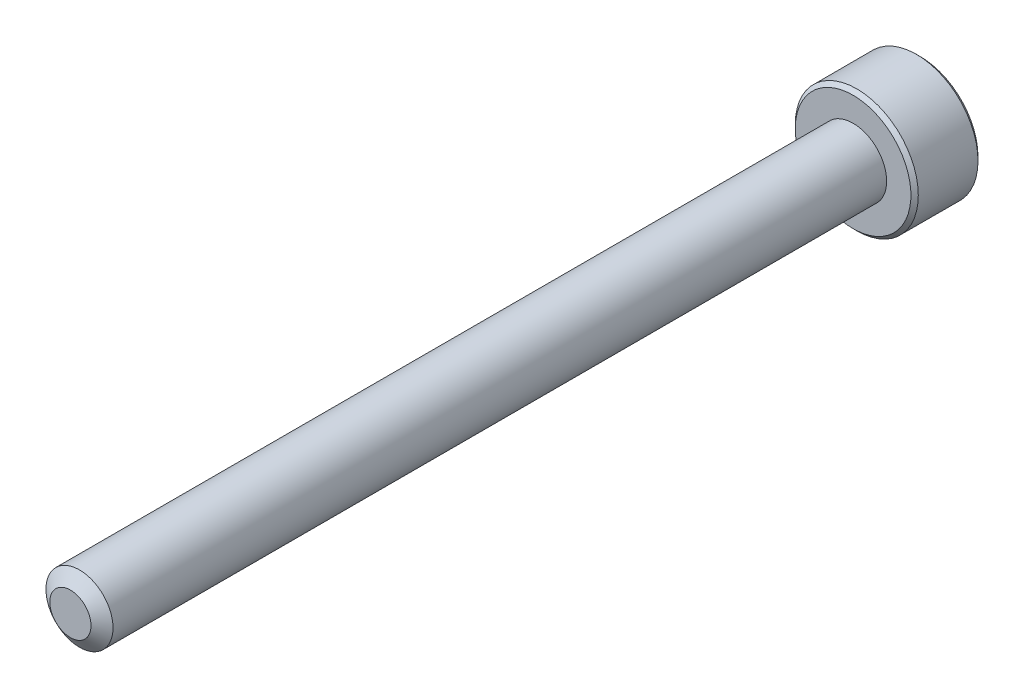
ISO-10303-21;
HEADER;
FILE_DESCRIPTION(('STEP AP214'),'2;1');
FILE_NAME('part.step','',(''),(''),'','','');
FILE_SCHEMA(('AUTOMOTIVE_DESIGN { 1 0 10303 214 1 1 1 1 }'));
ENDSEC;
DATA;
#1=APPLICATION_CONTEXT('core data for automotive mechanical design processes');
#2=APPLICATION_PROTOCOL_DEFINITION('international standard','automotive_design',2000,#1);
#3=PRODUCT_CONTEXT('',#1,'mechanical');
#4=PRODUCT('Part','Part','',(#3));
#5=PRODUCT_RELATED_PRODUCT_CATEGORY('part','',(#4));
#6=PRODUCT_DEFINITION_FORMATION('','',#4);
#7=PRODUCT_DEFINITION_CONTEXT('part definition',#1,'design');
#8=PRODUCT_DEFINITION('design','',#6,#7);
#9=PRODUCT_DEFINITION_SHAPE('','',#8);
#10=(LENGTH_UNIT() NAMED_UNIT(*) SI_UNIT(.MILLI.,.METRE.));
#11=(NAMED_UNIT(*) PLANE_ANGLE_UNIT() SI_UNIT($,.RADIAN.));
#12=(NAMED_UNIT(*) SI_UNIT($,.STERADIAN.) SOLID_ANGLE_UNIT());
#13=UNCERTAINTY_MEASURE_WITH_UNIT(LENGTH_MEASURE(1.E-05),#10,'distance_accuracy_value','');
#14=(GEOMETRIC_REPRESENTATION_CONTEXT(3) GLOBAL_UNCERTAINTY_ASSIGNED_CONTEXT((#13)) GLOBAL_UNIT_ASSIGNED_CONTEXT((#10,
#11,#12)) REPRESENTATION_CONTEXT('',''));
#15=CARTESIAN_POINT('',(0.,0.,0.));
#16=DIRECTION('',(0.,0.,1.));
#17=DIRECTION('',(1.,0.,0.));
#18=AXIS2_PLACEMENT_3D('',#15,#16,#17);
#19=CARTESIAN_POINT('',(0.,0.,-35.));
#20=DIRECTION('',(0.,0.,1.));
#21=DIRECTION('',(1.,0.,0.));
#22=AXIS2_PLACEMENT_3D('',#19,#20,#21);
#23=CYLINDRICAL_SURFACE('',#22,1.5);
#24=CARTESIAN_POINT('',(0.,0.,-35.));
#25=DIRECTION('',(0.,0.,-1.));
#26=DIRECTION('',(-1.,0.,0.));
#27=AXIS2_PLACEMENT_3D('',#24,#25,#26);
#28=CIRCLE('',#27,1.5);
#29=CARTESIAN_POINT('',(-1.5,0.,-35.));
#30=VERTEX_POINT('',#29);
#31=EDGE_CURVE('E219',#30,#30,#28,.F.);
#32=ORIENTED_EDGE('',*,*,#31,.T.);
#33=EDGE_LOOP('',(#32));
#34=FACE_BOUND('',#33,.T.);
#35=CARTESIAN_POINT('',(0.,0.,-0.405251783209379));
#36=DIRECTION('',(0.,0.,1.));
#37=DIRECTION('',(1.,0.,0.));
#38=AXIS2_PLACEMENT_3D('',#35,#36,#37);
#39=CIRCLE('',#38,1.5);
#40=CARTESIAN_POINT('',(1.5,0.,-0.405251783209379));
#41=VERTEX_POINT('',#40);
#42=EDGE_CURVE('E113',#41,#41,#39,.T.);
#43=ORIENTED_EDGE('',*,*,#42,.F.);
#44=EDGE_LOOP('',(#43));
#45=FACE_BOUND('',#44,.T.);
#46=ADVANCED_FACE('F39',(#34,#45),#23,.T.);
#47=CARTESIAN_POINT('',(0.,0.,0.));
#48=DIRECTION('',(0.,0.,-1.));
#49=DIRECTION('',(-1.,0.,0.));
#50=AXIS2_PLACEMENT_3D('',#47,#48,#49);
#51=CONICAL_SURFACE('',#50,0.921240473580834,0.959931088596884);
#52=ORIENTED_EDGE('',*,*,#42,.T.);
#53=EDGE_LOOP('',(#52));
#54=FACE_BOUND('',#53,.T.);
#55=CARTESIAN_POINT('',(0.,0.,0.));
#56=DIRECTION('',(0.,0.,1.));
#57=DIRECTION('',(1.,0.,0.));
#58=AXIS2_PLACEMENT_3D('',#55,#56,#57);
#59=CIRCLE('',#58,0.921240473580834);
#60=CARTESIAN_POINT('',(0.921240473580834,0.,0.));
#61=VERTEX_POINT('',#60);
#62=EDGE_CURVE('E217',#61,#61,#59,.T.);
#63=ORIENTED_EDGE('',*,*,#62,.F.);
#64=EDGE_LOOP('',(#63));
#65=FACE_BOUND('',#64,.T.);
#66=ADVANCED_FACE('F200',(#54,#65),#51,.T.);
#67=CARTESIAN_POINT('',(0.,0.,0.));
#68=DIRECTION('',(0.,0.,1.));
#69=DIRECTION('',(1.,0.,0.));
#70=AXIS2_PLACEMENT_3D('',#67,#68,#69);
#71=PLANE('',#70);
#72=ORIENTED_EDGE('',*,*,#62,.T.);
#73=EDGE_LOOP('',(#72));
#74=FACE_BOUND('',#73,.T.);
#75=ADVANCED_FACE('F197',(#74),#71,.T.);
#76=CARTESIAN_POINT('',(0.,0.,-38.));
#77=DIRECTION('',(0.,0.,1.));
#78=DIRECTION('',(1.,0.,0.));
#79=AXIS2_PLACEMENT_3D('',#76,#77,#78);
#80=CYLINDRICAL_SURFACE('',#79,2.75);
#81=CARTESIAN_POINT('',(0.,0.,-37.835));
#82=DIRECTION('',(0.,0.,-1.));
#83=DIRECTION('',(-1.,0.,0.));
#84=AXIS2_PLACEMENT_3D('',#81,#82,#83);
#85=CIRCLE('',#84,2.75);
#86=CARTESIAN_POINT('',(2.75,0.,-37.835));
#87=VERTEX_POINT('',#86);
#88=EDGE_CURVE('E47',#87,#87,#85,.F.);
#89=ORIENTED_EDGE('',*,*,#88,.T.);
#90=EDGE_LOOP('',(#89));
#91=FACE_BOUND('',#90,.T.);
#92=CARTESIAN_POINT('',(0.,0.,-35.165));
#93=DIRECTION('',(0.,0.,-1.));
#94=DIRECTION('',(-1.,0.,0.));
#95=AXIS2_PLACEMENT_3D('',#92,#93,#94);
#96=CIRCLE('',#95,2.75);
#97=CARTESIAN_POINT('',(-2.75,0.,-35.165));
#98=VERTEX_POINT('',#97);
#99=EDGE_CURVE('E176',#98,#98,#96,.T.);
#100=ORIENTED_EDGE('',*,*,#99,.T.);
#101=EDGE_LOOP('',(#100));
#102=FACE_BOUND('',#101,.T.);
#103=ADVANCED_FACE('F181',(#91,#102),#80,.T.);
#104=CARTESIAN_POINT('',(0.,0.,-38.));
#105=DIRECTION('',(0.,0.,-1.));
#106=DIRECTION('',(-1.,0.,0.));
#107=AXIS2_PLACEMENT_3D('',#104,#105,#106);
#108=PLANE('',#107);
#109=CARTESIAN_POINT('',(0.,0.,-38.));
#110=DIRECTION('',(0.,0.,-1.));
#111=DIRECTION('',(-1.,0.,0.));
#112=AXIS2_PLACEMENT_3D('',#109,#110,#111);
#113=CIRCLE('',#112,2.58500000000001);
#114=CARTESIAN_POINT('',(2.58500000000001,0.,-38.));
#115=VERTEX_POINT('',#114);
#116=EDGE_CURVE('E112',#115,#115,#113,.T.);
#117=ORIENTED_EDGE('',*,*,#116,.T.);
#118=EDGE_LOOP('',(#117));
#119=FACE_BOUND('',#118,.T.);
#120=CARTESIAN_POINT('',(0.,0.,-38.));
#121=DIRECTION('',(0.,0.,-1.));
#122=DIRECTION('',(-1.,0.,0.));
#123=AXIS2_PLACEMENT_3D('',#120,#121,#122);
#124=CIRCLE('',#123,1.44337567297406);
#125=CARTESIAN_POINT('',(-1.25,0.721687836487032,-38.));
#126=VERTEX_POINT('',#125);
#127=CARTESIAN_POINT('',(0.,1.44337567297407,-38.));
#128=VERTEX_POINT('',#127);
#129=EDGE_CURVE('E93',#126,#128,#124,.T.);
#130=ORIENTED_EDGE('',*,*,#129,.F.);
#131=CARTESIAN_POINT('',(-1.25,-0.721687836487032,-38.));
#132=VERTEX_POINT('',#131);
#133=EDGE_CURVE('E53',#132,#126,#124,.T.);
#134=ORIENTED_EDGE('',*,*,#133,.F.);
#135=CARTESIAN_POINT('',(0.,-1.44337567297406,-38.));
#136=VERTEX_POINT('',#135);
#137=EDGE_CURVE('E278',#136,#132,#124,.T.);
#138=ORIENTED_EDGE('',*,*,#137,.F.);
#139=CARTESIAN_POINT('',(1.25,-0.721687836487032,-38.));
#140=VERTEX_POINT('',#139);
#141=EDGE_CURVE('E60',#140,#136,#124,.T.);
#142=ORIENTED_EDGE('',*,*,#141,.F.);
#143=CARTESIAN_POINT('',(1.25,0.721687836487033,-38.));
#144=VERTEX_POINT('',#143);
#145=EDGE_CURVE('E134',#144,#140,#124,.T.);
#146=ORIENTED_EDGE('',*,*,#145,.F.);
#147=EDGE_CURVE('E102',#128,#144,#124,.T.);
#148=ORIENTED_EDGE('',*,*,#147,.F.);
#149=EDGE_LOOP('',(#130,#134,#138,#142,#146,#148));
#150=FACE_BOUND('',#149,.T.);
#151=ADVANCED_FACE('F133',(#119,#150),#108,.T.);
#152=CARTESIAN_POINT('',(0.,0.,-35.));
#153=DIRECTION('',(0.,0.,-1.));
#154=DIRECTION('',(-1.,0.,0.));
#155=AXIS2_PLACEMENT_3D('',#152,#153,#154);
#156=PLANE('',#155);
#157=CARTESIAN_POINT('',(0.,0.,-35.));
#158=DIRECTION('',(0.,0.,-1.));
#159=DIRECTION('',(-1.,0.,0.));
#160=AXIS2_PLACEMENT_3D('',#157,#158,#159);
#161=CIRCLE('',#160,2.585);
#162=CARTESIAN_POINT('',(-2.585,0.,-35.));
#163=VERTEX_POINT('',#162);
#164=EDGE_CURVE('E11',#163,#163,#161,.F.);
#165=ORIENTED_EDGE('',*,*,#164,.T.);
#166=EDGE_LOOP('',(#165));
#167=FACE_BOUND('',#166,.T.);
#168=ORIENTED_EDGE('',*,*,#31,.F.);
#169=EDGE_LOOP('',(#168));
#170=FACE_BOUND('',#169,.T.);
#171=ADVANCED_FACE('F190',(#167,#170),#156,.F.);
#172=CARTESIAN_POINT('',(0.,0.,-38.));
#173=DIRECTION('',(0.,0.,-1.));
#174=DIRECTION('',(-1.,0.,0.));
#175=AXIS2_PLACEMENT_3D('',#172,#173,#174);
#176=CONICAL_SURFACE('',#175,1.44337567297406,0.78539816339745);
#177=ORIENTED_EDGE('',*,*,#147,.T.);
#178=CARTESIAN_POINT('',(-0.000200000000000386,1.4434911430279,-38.0001154839091));
#179=CARTESIAN_POINT('',(0.0427751670715883,1.41867941875065,-37.9753216680551));
#180=CARTESIAN_POINT('',(0.0864690047459503,1.39345276980743,-37.9519837344187));
#181=CARTESIAN_POINT('',(0.175565930841944,1.34201263554194,-37.9092520040845));
#182=CARTESIAN_POINT('',(0.220977498357066,1.31579425481276,-37.8898819923604));
#183=CARTESIAN_POINT('',(0.312547820935262,1.26292610442246,-37.8567004834135));
#184=CARTESIAN_POINT('',(0.35868324017589,1.23628980770471,-37.8428055590527));
#185=CARTESIAN_POINT('',(0.451970080407598,1.18243062538508,-37.8213972821606));
#186=CARTESIAN_POINT('',(0.499118649136385,1.15520938653761,-37.8138679415668));
#187=CARTESIAN_POINT('',(0.580373556887258,1.10829684367467,-37.8070744980507));
#188=CARTESIAN_POINT('',(0.614374876627946,1.08866617256958,-37.8060685591044));
#189=CARTESIAN_POINT('',(0.682317764432483,1.04943932800611,-37.8077614149113));
#190=CARTESIAN_POINT('',(0.716259317655663,1.02984316311599,-37.8104610272155));
#191=CARTESIAN_POINT('',(0.783814856457506,0.990839954603496,-37.8194089303164));
#192=CARTESIAN_POINT('',(0.817428507286782,0.971433104248767,-37.8256605258997));
#193=CARTESIAN_POINT('',(0.88409463821782,0.932943395609901,-37.8413756814139));
#194=CARTESIAN_POINT('',(0.917146871030302,0.913860680098297,-37.8508406200875));
#195=CARTESIAN_POINT('',(1.00179969160027,0.864986351354565,-37.8789313906876));
#196=CARTESIAN_POINT('',(1.05286649242964,0.835502920149075,-37.8996701574522));
#197=CARTESIAN_POINT('',(1.15300085411326,0.777690319475908,-37.9463871346715));
#198=CARTESIAN_POINT('',(1.20207431157827,0.749357745598416,-37.9723482959468));
#199=CARTESIAN_POINT('',(1.2502,0.721572366433194,-38.0001154839091));
#200=B_SPLINE_CURVE_WITH_KNOTS('',3,(#178,#179,#180,#181,#182,#183,#184,#185,#186,#187,#188,
#189,#190,#191,#192,#193,#194,#195,#196,#197,#198,#199),.UNSPECIFIED.,.F.,.F.,(4,2,2,2,2,2,2,2,
2,2,4),(0.,0.166533409618307,0.334037607289766,0.498880396489705,0.663307919240281,
0.780963963458834,0.898645970148461,1.01643764860774,1.1342799317155,1.32148652032141,
1.50809158792574),.UNSPECIFIED.);
#201=EDGE_CURVE('E107',#128,#144,#200,.T.);
#202=ORIENTED_EDGE('',*,*,#201,.F.);
#203=EDGE_LOOP('',(#177,#202));
#204=FACE_BOUND('',#203,.T.);
#205=ADVANCED_FACE('F108',(#204),#176,.F.);
#206=ORIENTED_EDGE('',*,*,#145,.T.);
#207=CARTESIAN_POINT('',(1.25,-1.43934010808077,-38.4629820968923));
#208=CARTESIAN_POINT('',(1.25,-1.40429313005659,-38.4365249226329));
#209=CARTESIAN_POINT('',(1.25,-1.36905087135599,-38.4103271603543));
#210=CARTESIAN_POINT('',(1.25,-1.29809650706311,-38.3585575718396));
#211=CARTESIAN_POINT('',(1.25,-1.26238428576495,-38.3329859043563));
#212=CARTESIAN_POINT('',(1.25,-1.15390111792707,-38.2570059936895));
#213=CARTESIAN_POINT('',(1.25,-1.08031646726264,-38.2077402861896));
#214=CARTESIAN_POINT('',(1.25,-0.926012322755091,-38.1110258302631));
#215=CARTESIAN_POINT('',(1.25,-0.845125318656143,-38.0638412989418));
#216=CARTESIAN_POINT('',(1.25,-0.6793111740766,-37.9775307343904));
#217=CARTESIAN_POINT('',(1.25,-0.594398891026685,-37.9383775346269));
#218=CARTESIAN_POINT('',(1.25,-0.466944812460736,-37.8904772236883));
#219=CARTESIAN_POINT('',(1.25,-0.426289985812818,-37.8767294897863));
#220=CARTESIAN_POINT('',(1.25,-0.343998850091266,-37.8524979274505));
#221=CARTESIAN_POINT('',(1.25,-0.302362473614962,-37.8420143238698));
#222=CARTESIAN_POINT('',(1.25,-0.219052696285667,-37.8250301617483));
#223=CARTESIAN_POINT('',(1.25,-0.177393428474502,-37.8184613604714));
#224=CARTESIAN_POINT('',(1.25,-0.0936293693401951,-37.8094350534578));
#225=CARTESIAN_POINT('',(1.25,-0.0515246558543992,-37.8069768409973));
#226=CARTESIAN_POINT('',(1.25,0.0311890576306285,-37.8063540620133));
#227=CARTESIAN_POINT('',(1.25,0.0717969625499278,-37.8080371168463));
#228=CARTESIAN_POINT('',(1.25,0.152668636885195,-37.8152682705979));
#229=CARTESIAN_POINT('',(1.25,0.192932338835356,-37.8208171104131));
#230=CARTESIAN_POINT('',(1.25,0.273499879165292,-37.835571036465));
#231=CARTESIAN_POINT('',(1.25,0.313792180618508,-37.8448381759641));
#232=CARTESIAN_POINT('',(1.25,0.393496413911454,-37.8665361784574));
#233=CARTESIAN_POINT('',(1.25,0.432908419115057,-37.8789667767306));
#234=CARTESIAN_POINT('',(1.25,0.556992735862295,-37.9227793529314));
#235=CARTESIAN_POINT('',(1.25,0.63989892466608,-37.959151072876));
#236=CARTESIAN_POINT('',(1.25,0.801816555499693,-38.0400191621783));
#237=CARTESIAN_POINT('',(1.25,0.880812666325035,-38.084544720912));
#238=CARTESIAN_POINT('',(1.25,1.03178561279749,-38.1764048766666));
#239=CARTESIAN_POINT('',(1.25,1.10391618485085,-38.2234899339162));
#240=CARTESIAN_POINT('',(1.25,1.2101860604331,-38.2962785615985));
#241=CARTESIAN_POINT('',(1.25,1.24515069969379,-38.3207980853934));
#242=CARTESIAN_POINT('',(1.25,1.31460220852736,-38.3704856367657));
#243=CARTESIAN_POINT('',(1.25,1.34908920596617,-38.3956534854155));
#244=CARTESIAN_POINT('',(1.25,1.38337731682911,-38.4210901488412));
#245=B_SPLINE_CURVE_WITH_KNOTS('',3,(#207,#208,#209,#210,#211,#212,#213,#214,#215,#216,#217,
#218,#219,#220,#221,#222,#223,#224,#225,#226,#227,#228,#229,#230,#231,#232,#233,#234,#235,#236,
#237,#238,#239,#240,#241,#242,#243,#244),.UNSPECIFIED.,.F.,.F.,(4,2,2,2,2,2,2,2,2,2,2,2,2,2,2,2,
2,2,4),(0.,0.131732960381451,0.26349898416165,0.52904201445583,0.809741926134621,
1.08947609717226,1.21811634272577,1.346765447839,1.47310084517844,1.59941451973784,
1.72115042167849,1.84290966131735,1.96679153905341,2.09066305366039,2.36146692896008,
2.6332598919849,2.89154668212278,3.01965734507712,3.14773302245628),.UNSPECIFIED.);
#246=EDGE_CURVE('E101',#144,#140,#245,.F.);
#247=ORIENTED_EDGE('',*,*,#246,.F.);
#248=EDGE_LOOP('',(#206,#247));
#249=FACE_BOUND('',#248,.T.);
#250=ADVANCED_FACE('F284',(#249),#176,.F.);
#251=ORIENTED_EDGE('',*,*,#141,.T.);
#252=CARTESIAN_POINT('',(1.2502,-0.721572366433195,-38.0001154839091));
#253=CARTESIAN_POINT('',(1.20722483292841,-0.746384090710445,-37.9753216680551));
#254=CARTESIAN_POINT('',(1.16353099525405,-0.771610739653666,-37.9519837344187));
#255=CARTESIAN_POINT('',(1.07443406915806,-0.823050873919157,-37.9092520040845));
#256=CARTESIAN_POINT('',(1.02902250164293,-0.849269254648335,-37.8898819923604));
#257=CARTESIAN_POINT('',(0.937452179064738,-0.902137405038637,-37.8567004834135));
#258=CARTESIAN_POINT('',(0.891316759824111,-0.92877370175639,-37.8428055590527));
#259=CARTESIAN_POINT('',(0.798029919592402,-0.982632884076016,-37.8213972821606));
#260=CARTESIAN_POINT('',(0.750881350863615,-1.00985412292349,-37.8138679415668));
#261=CARTESIAN_POINT('',(0.669626443112742,-1.05676666578643,-37.8070744980507));
#262=CARTESIAN_POINT('',(0.635625123372053,-1.07639733689152,-37.8060685591044));
#263=CARTESIAN_POINT('',(0.567682235567517,-1.11562418145499,-37.8077614149113));
#264=CARTESIAN_POINT('',(0.533740682344337,-1.13522034634511,-37.8104610272155));
#265=CARTESIAN_POINT('',(0.466185143542494,-1.1742235548576,-37.8194089303164));
#266=CARTESIAN_POINT('',(0.432571492713218,-1.19363040521233,-37.8256605258997));
#267=CARTESIAN_POINT('',(0.365905361782179,-1.2321201138512,-37.8413756814139));
#268=CARTESIAN_POINT('',(0.332853128969697,-1.2512028293628,-37.8508406200875));
#269=CARTESIAN_POINT('',(0.24820030839973,-1.30007715810653,-37.8789313906876));
#270=CARTESIAN_POINT('',(0.197133507570358,-1.32956058931202,-37.8996701574522));
#271=CARTESIAN_POINT('',(0.0969991458867432,-1.38737318998519,-37.9463871346715));
#272=CARTESIAN_POINT('',(0.0479256884217291,-1.41570576386268,-37.9723482959468));
#273=CARTESIAN_POINT('',(-0.000200000000000841,-1.4434911430279,-38.0001154839091));
#274=B_SPLINE_CURVE_WITH_KNOTS('',3,(#252,#253,#254,#255,#256,#257,#258,#259,#260,#261,#262,
#263,#264,#265,#266,#267,#268,#269,#270,#271,#272,#273),.UNSPECIFIED.,.F.,.F.,(4,2,2,2,2,2,2,2,
2,2,4),(0.,0.166533409618307,0.334037607289766,0.498880396489705,0.663307919240282,
0.780963963458834,0.898645970148461,1.01643764860774,1.1342799317155,1.32148652032141,
1.50809158792574),.UNSPECIFIED.);
#275=EDGE_CURVE('E144',#140,#136,#274,.T.);
#276=ORIENTED_EDGE('',*,*,#275,.F.);
#277=EDGE_LOOP('',(#251,#276));
#278=FACE_BOUND('',#277,.T.);
#279=ADVANCED_FACE('F281',(#278),#176,.F.);
#280=ORIENTED_EDGE('',*,*,#137,.T.);
#281=CARTESIAN_POINT('',(0.000200000000000392,-1.4434911430279,-38.0001154839091));
#282=CARTESIAN_POINT('',(-0.0427751670715882,-1.41867941875065,-37.9753216680551));
#283=CARTESIAN_POINT('',(-0.0864690047459503,-1.39345276980743,-37.9519837344187));
#284=CARTESIAN_POINT('',(-0.175565930841944,-1.34201263554194,-37.9092520040845));
#285=CARTESIAN_POINT('',(-0.220977498357066,-1.31579425481276,-37.8898819923604));
#286=CARTESIAN_POINT('',(-0.312547820935262,-1.26292610442246,-37.8567004834135));
#287=CARTESIAN_POINT('',(-0.358683240175889,-1.23628980770471,-37.8428055590527));
#288=CARTESIAN_POINT('',(-0.451970080407597,-1.18243062538508,-37.8213972821606));
#289=CARTESIAN_POINT('',(-0.499118649136384,-1.15520938653761,-37.8138679415668));
#290=CARTESIAN_POINT('',(-0.580373556887257,-1.10829684367467,-37.8070744980507));
#291=CARTESIAN_POINT('',(-0.614374876627946,-1.08866617256958,-37.8060685591044));
#292=CARTESIAN_POINT('',(-0.682317764432483,-1.04943932800611,-37.8077614149113));
#293=CARTESIAN_POINT('',(-0.716259317655663,-1.02984316311599,-37.8104610272155));
#294=CARTESIAN_POINT('',(-0.783814856457506,-0.990839954603496,-37.8194089303164));
#295=CARTESIAN_POINT('',(-0.817428507286782,-0.971433104248768,-37.8256605258997));
#296=CARTESIAN_POINT('',(-0.88409463821782,-0.932943395609902,-37.8413756814139));
#297=CARTESIAN_POINT('',(-0.917146871030302,-0.913860680098297,-37.8508406200875));
#298=CARTESIAN_POINT('',(-1.00179969160027,-0.864986351354565,-37.8789313906876));
#299=CARTESIAN_POINT('',(-1.05286649242964,-0.835502920149074,-37.8996701574522));
#300=CARTESIAN_POINT('',(-1.15300085411326,-0.777690319475908,-37.9463871346715));
#301=CARTESIAN_POINT('',(-1.20207431157827,-0.749357745598416,-37.9723482959468));
#302=CARTESIAN_POINT('',(-1.2502,-0.721572366433194,-38.0001154839091));
#303=B_SPLINE_CURVE_WITH_KNOTS('',3,(#281,#282,#283,#284,#285,#286,#287,#288,#289,#290,#291,
#292,#293,#294,#295,#296,#297,#298,#299,#300,#301,#302),.UNSPECIFIED.,.F.,.F.,(4,2,2,2,2,2,2,2,
2,2,4),(0.,0.166533409618307,0.334037607289766,0.498880396489704,0.663307919240281,
0.780963963458834,0.898645970148461,1.01643764860774,1.1342799317155,1.32148652032141,
1.50809158792574),.UNSPECIFIED.);
#304=EDGE_CURVE('E255',#136,#132,#303,.T.);
#305=ORIENTED_EDGE('',*,*,#304,.F.);
#306=EDGE_LOOP('',(#280,#305));
#307=FACE_BOUND('',#306,.T.);
#308=ADVANCED_FACE('F280',(#307),#176,.F.);
#309=ORIENTED_EDGE('',*,*,#133,.T.);
#310=CARTESIAN_POINT('',(-1.25,-1.43934010829019,-38.4629820970504));
#311=CARTESIAN_POINT('',(-1.25,-1.40429313026013,-38.4365249227849));
#312=CARTESIAN_POINT('',(-1.25,-1.36905087155364,-38.4103271605002));
#313=CARTESIAN_POINT('',(-1.25,-1.29809650724891,-38.3585575719734));
#314=CARTESIAN_POINT('',(-1.25,-1.2623842859448,-38.3329859044841));
#315=CARTESIAN_POINT('',(-1.25,-1.15390111808871,-38.257005993799));
#316=CARTESIAN_POINT('',(-1.25,-1.08031646741188,-38.207740286287));
#317=CARTESIAN_POINT('',(-1.25,-0.926012322877304,-38.1110258303356));
#318=CARTESIAN_POINT('',(-1.25,-0.845125318763651,-38.0638412990016));
#319=CARTESIAN_POINT('',(-1.25,-0.679311174153446,-37.9775307344266));
#320=CARTESIAN_POINT('',(-1.25,-0.594398891087586,-37.9383775346522));
#321=CARTESIAN_POINT('',(-1.25,-0.466944812509641,-37.8904772237056));
#322=CARTESIAN_POINT('',(-1.25,-0.426289985866745,-37.8767294898039));
#323=CARTESIAN_POINT('',(-1.25,-0.343998850155402,-37.8524979274677));
#324=CARTESIAN_POINT('',(-1.25,-0.302362473684285,-37.8420143238863));
#325=CARTESIAN_POINT('',(-1.25,-0.219052696365193,-37.8250301617622));
#326=CARTESIAN_POINT('',(-1.25,-0.177393428559042,-37.8184613604834));
#327=CARTESIAN_POINT('',(-1.25,-0.0936293694345948,-37.809435053465));
#328=CARTESIAN_POINT('',(-1.25,-0.051524655953645,-37.8069768410015));
#329=CARTESIAN_POINT('',(-1.25,0.0311890575224428,-37.8063540620107));
#330=CARTESIAN_POINT('',(-1.25,0.0717969624376358,-37.8080371168399));
#331=CARTESIAN_POINT('',(-1.25,0.152668636765096,-37.8152682705835));
#332=CARTESIAN_POINT('',(-1.25,0.192932338711557,-37.8208171103943));
#333=CARTESIAN_POINT('',(-1.25,0.273499879034192,-37.835571036437));
#334=CARTESIAN_POINT('',(-1.25,0.313792180483818,-37.8448381759314));
#335=CARTESIAN_POINT('',(-1.25,0.393496413769929,-37.8665361784149));
#336=CARTESIAN_POINT('',(-1.25,0.432908418970287,-37.8789667766833));
#337=CARTESIAN_POINT('',(-1.25,0.556992735686001,-37.9227793528609));
#338=CARTESIAN_POINT('',(-1.25,0.639898924463087,-37.9591510727842));
#339=CARTESIAN_POINT('',(-1.25,0.801816555245352,-38.0400191620416));
#340=CARTESIAN_POINT('',(-1.25,0.880812666046058,-38.0845447207516));
#341=CARTESIAN_POINT('',(-1.25,1.03178561247422,-38.176404876461));
#342=CARTESIAN_POINT('',(-1.25,1.10391618450776,-38.2234899336892));
#343=CARTESIAN_POINT('',(-1.25,1.21018606006071,-38.2962785613395));
#344=CARTESIAN_POINT('',(-1.25,1.24515069931177,-38.3207980851238));
#345=CARTESIAN_POINT('',(-1.25,1.31460220812616,-38.370485636475));
#346=CARTESIAN_POINT('',(-1.25,1.34908920555541,-38.3956534851142));
#347=CARTESIAN_POINT('',(-1.25,1.38337731640879,-38.4210901485294));
#348=B_SPLINE_CURVE_WITH_KNOTS('',3,(#310,#311,#312,#313,#314,#315,#316,#317,#318,#319,#320,
#321,#322,#323,#324,#325,#326,#327,#328,#329,#330,#331,#332,#333,#334,#335,#336,#337,#338,#339,
#340,#341,#342,#343,#344,#345,#346,#347),.UNSPECIFIED.,.F.,.F.,(4,2,2,2,2,2,2,2,2,2,2,2,2,2,2,2,
2,2,4),(0.,0.131732960406522,0.263498984211802,0.529042014557081,0.80974192629318,
1.08947609738757,1.21811634292656,1.3467654480253,1.47310084535082,1.59941451989632,
1.72115042182425,1.84290966145035,1.9667915391727,2.09066305376596,2.36146692896708,
2.63325989189268,2.89154668194566,3.01965734485813,3.14773302219541),.UNSPECIFIED.);
#349=EDGE_CURVE('E123',#132,#126,#348,.T.);
#350=ORIENTED_EDGE('',*,*,#349,.F.);
#351=EDGE_LOOP('',(#309,#350));
#352=FACE_BOUND('',#351,.T.);
#353=ADVANCED_FACE('F293',(#352),#176,.F.);
#354=ORIENTED_EDGE('',*,*,#129,.T.);
#355=CARTESIAN_POINT('',(-1.2502,0.721572366433195,-38.0001154839091));
#356=CARTESIAN_POINT('',(-1.20722483292841,0.746384090710445,-37.9753216680551));
#357=CARTESIAN_POINT('',(-1.16353099525405,0.771610739653666,-37.9519837344187));
#358=CARTESIAN_POINT('',(-1.07443406915806,0.823050873919157,-37.9092520040845));
#359=CARTESIAN_POINT('',(-1.02902250164293,0.849269254648335,-37.8898819923604));
#360=CARTESIAN_POINT('',(-0.937452179064738,0.902137405038637,-37.8567004834135));
#361=CARTESIAN_POINT('',(-0.891316759824111,0.92877370175639,-37.8428055590527));
#362=CARTESIAN_POINT('',(-0.798029919592402,0.982632884076016,-37.8213972821606));
#363=CARTESIAN_POINT('',(-0.750881350863615,1.00985412292349,-37.8138679415668));
#364=CARTESIAN_POINT('',(-0.669626443112742,1.05676666578643,-37.8070744980507));
#365=CARTESIAN_POINT('',(-0.635625123372053,1.07639733689152,-37.8060685591044));
#366=CARTESIAN_POINT('',(-0.567682235567517,1.11562418145499,-37.8077614149113));
#367=CARTESIAN_POINT('',(-0.533740682344337,1.13522034634511,-37.8104610272155));
#368=CARTESIAN_POINT('',(-0.466185143542494,1.1742235548576,-37.8194089303164));
#369=CARTESIAN_POINT('',(-0.432571492713218,1.19363040521233,-37.8256605258997));
#370=CARTESIAN_POINT('',(-0.365905361782179,1.2321201138512,-37.8413756814139));
#371=CARTESIAN_POINT('',(-0.332853128969697,1.2512028293628,-37.8508406200875));
#372=CARTESIAN_POINT('',(-0.24820030839973,1.30007715810653,-37.8789313906876));
#373=CARTESIAN_POINT('',(-0.197133507570358,1.32956058931202,-37.8996701574522));
#374=CARTESIAN_POINT('',(-0.0969991458867433,1.38737318998519,-37.9463871346715));
#375=CARTESIAN_POINT('',(-0.0479256884217293,1.41570576386268,-37.9723482959468));
#376=CARTESIAN_POINT('',(0.000200000000000657,1.4434911430279,-38.0001154839091));
#377=B_SPLINE_CURVE_WITH_KNOTS('',3,(#355,#356,#357,#358,#359,#360,#361,#362,#363,#364,#365,
#366,#367,#368,#369,#370,#371,#372,#373,#374,#375,#376),.UNSPECIFIED.,.F.,.F.,(4,2,2,2,2,2,2,2,
2,2,4),(0.,0.166533409618307,0.334037607289766,0.498880396489705,0.663307919240282,
0.780963963458834,0.898645970148461,1.01643764860774,1.1342799317155,1.32148652032141,
1.50809158792574),.UNSPECIFIED.);
#378=EDGE_CURVE('E97',#126,#128,#377,.T.);
#379=ORIENTED_EDGE('',*,*,#378,.F.);
#380=EDGE_LOOP('',(#354,#379));
#381=FACE_BOUND('',#380,.T.);
#382=ADVANCED_FACE('F95',(#381),#176,.F.);
#383=CARTESIAN_POINT('',(1.25,2.1650635094611,-36.125));
#384=DIRECTION('',(0.,0.,-1.));
#385=DIRECTION('',(-1.,0.,0.));
#386=AXIS2_PLACEMENT_3D('',#383,#384,#385);
#387=PLANE('',#386);
#388=DIRECTION('',(0.866025403784439,0.5,0.));
#389=VECTOR('',#388,1.);
#390=CARTESIAN_POINT('',(-1.25,0.721687836487032,-36.125));
#391=LINE('',#390,#389);
#392=CARTESIAN_POINT('',(-1.25,0.721687836487032,-36.125));
#393=VERTEX_POINT('',#392);
#394=CARTESIAN_POINT('',(0.,1.44337567297406,-36.125));
#395=VERTEX_POINT('',#394);
#396=EDGE_CURVE('E122',#393,#395,#391,.T.);
#397=ORIENTED_EDGE('',*,*,#396,.T.);
#398=DIRECTION('',(0.866025403784439,-0.5,0.));
#399=VECTOR('',#398,1.);
#400=CARTESIAN_POINT('',(0.,1.44337567297406,-36.125));
#401=LINE('',#400,#399);
#402=CARTESIAN_POINT('',(1.25,0.721687836487032,-36.125));
#403=VERTEX_POINT('',#402);
#404=EDGE_CURVE('E127',#395,#403,#401,.T.);
#405=ORIENTED_EDGE('',*,*,#404,.T.);
#406=DIRECTION('',(0.,-1.,0.));
#407=VECTOR('',#406,1.);
#408=CARTESIAN_POINT('',(1.25,0.721687836487032,-36.125));
#409=LINE('',#408,#407);
#410=CARTESIAN_POINT('',(1.25,-0.721687836487033,-36.125));
#411=VERTEX_POINT('',#410);
#412=EDGE_CURVE('E241',#403,#411,#409,.T.);
#413=ORIENTED_EDGE('',*,*,#412,.T.);
#414=DIRECTION('',(-0.866025403784439,-0.5,0.));
#415=VECTOR('',#414,1.);
#416=CARTESIAN_POINT('',(1.25,-0.721687836487033,-36.125));
#417=LINE('',#416,#415);
#418=CARTESIAN_POINT('',(0.,-1.44337567297406,-36.125));
#419=VERTEX_POINT('',#418);
#420=EDGE_CURVE('E238',#411,#419,#417,.T.);
#421=ORIENTED_EDGE('',*,*,#420,.T.);
#422=DIRECTION('',(-0.866025403784439,0.5,0.));
#423=VECTOR('',#422,1.);
#424=CARTESIAN_POINT('',(0.,-1.44337567297406,-36.125));
#425=LINE('',#424,#423);
#426=CARTESIAN_POINT('',(-1.25,-0.721687836487032,-36.125));
#427=VERTEX_POINT('',#426);
#428=EDGE_CURVE('E235',#419,#427,#425,.T.);
#429=ORIENTED_EDGE('',*,*,#428,.T.);
#430=DIRECTION('',(0.,1.,0.));
#431=VECTOR('',#430,1.);
#432=CARTESIAN_POINT('',(-1.25,-0.721687836487032,-36.125));
#433=LINE('',#432,#431);
#434=EDGE_CURVE('E130',#427,#393,#433,.T.);
#435=ORIENTED_EDGE('',*,*,#434,.T.);
#436=EDGE_LOOP('',(#397,#405,#413,#421,#429,#435));
#437=FACE_BOUND('',#436,.T.);
#438=ADVANCED_FACE('F164',(#437),#387,.T.);
#439=CARTESIAN_POINT('',(0.,1.44337567297406,-36.125));
#440=DIRECTION('',(0.5,0.866025403784439,0.));
#441=DIRECTION('',(-0.866025403784439,0.5,0.));
#442=AXIS2_PLACEMENT_3D('',#439,#440,#441);
#443=PLANE('',#442);
#444=DIRECTION('',(0.,0.,-1.));
#445=VECTOR('',#444,1.);
#446=CARTESIAN_POINT('',(0.,1.44337567297406,-36.125));
#447=LINE('',#446,#445);
#448=EDGE_CURVE('E119',#395,#128,#447,.T.);
#449=ORIENTED_EDGE('',*,*,#448,.T.);
#450=ORIENTED_EDGE('',*,*,#201,.T.);
#451=DIRECTION('',(0.,0.,-1.));
#452=VECTOR('',#451,1.);
#453=CARTESIAN_POINT('',(1.25,0.721687836487032,-36.125));
#454=LINE('',#453,#452);
#455=EDGE_CURVE('E129',#403,#144,#454,.T.);
#456=ORIENTED_EDGE('',*,*,#455,.F.);
#457=ORIENTED_EDGE('',*,*,#404,.F.);
#458=EDGE_LOOP('',(#449,#450,#456,#457));
#459=FACE_BOUND('',#458,.T.);
#460=ADVANCED_FACE('F125',(#459),#443,.F.);
#461=CARTESIAN_POINT('',(1.25,0.721687836487032,-36.125));
#462=DIRECTION('',(1.,0.,0.));
#463=DIRECTION('',(0.,0.,-1.));
#464=AXIS2_PLACEMENT_3D('',#461,#462,#463);
#465=PLANE('',#464);
#466=ORIENTED_EDGE('',*,*,#455,.T.);
#467=ORIENTED_EDGE('',*,*,#246,.T.);
#468=DIRECTION('',(0.,0.,-1.));
#469=VECTOR('',#468,1.);
#470=CARTESIAN_POINT('',(1.25,-0.721687836487033,-36.125));
#471=LINE('',#470,#469);
#472=EDGE_CURVE('E224',#411,#140,#471,.T.);
#473=ORIENTED_EDGE('',*,*,#472,.F.);
#474=ORIENTED_EDGE('',*,*,#412,.F.);
#475=EDGE_LOOP('',(#466,#467,#473,#474));
#476=FACE_BOUND('',#475,.T.);
#477=ADVANCED_FACE('F153',(#476),#465,.F.);
#478=CARTESIAN_POINT('',(1.25,-0.721687836487033,-36.125));
#479=DIRECTION('',(0.5,-0.866025403784439,0.));
#480=DIRECTION('',(0.866025403784439,0.5,0.));
#481=AXIS2_PLACEMENT_3D('',#478,#479,#480);
#482=PLANE('',#481);
#483=ORIENTED_EDGE('',*,*,#472,.T.);
#484=ORIENTED_EDGE('',*,*,#275,.T.);
#485=DIRECTION('',(0.,0.,-1.));
#486=VECTOR('',#485,1.);
#487=CARTESIAN_POINT('',(0.,-1.44337567297406,-36.125));
#488=LINE('',#487,#486);
#489=EDGE_CURVE('E227',#419,#136,#488,.T.);
#490=ORIENTED_EDGE('',*,*,#489,.F.);
#491=ORIENTED_EDGE('',*,*,#420,.F.);
#492=EDGE_LOOP('',(#483,#484,#490,#491));
#493=FACE_BOUND('',#492,.T.);
#494=ADVANCED_FACE('F157',(#493),#482,.F.);
#495=CARTESIAN_POINT('',(0.,-1.44337567297406,-36.125));
#496=DIRECTION('',(-0.5,-0.866025403784439,0.));
#497=DIRECTION('',(0.866025403784439,-0.5,0.));
#498=AXIS2_PLACEMENT_3D('',#495,#496,#497);
#499=PLANE('',#498);
#500=ORIENTED_EDGE('',*,*,#489,.T.);
#501=ORIENTED_EDGE('',*,*,#304,.T.);
#502=DIRECTION('',(0.,0.,-1.));
#503=VECTOR('',#502,1.);
#504=CARTESIAN_POINT('',(-1.25,-0.721687836487032,-36.125));
#505=LINE('',#504,#503);
#506=EDGE_CURVE('E230',#427,#132,#505,.T.);
#507=ORIENTED_EDGE('',*,*,#506,.F.);
#508=ORIENTED_EDGE('',*,*,#428,.F.);
#509=EDGE_LOOP('',(#500,#501,#507,#508));
#510=FACE_BOUND('',#509,.T.);
#511=ADVANCED_FACE('F263',(#510),#499,.F.);
#512=CARTESIAN_POINT('',(-1.25,-0.721687836487032,-36.125));
#513=DIRECTION('',(-1.,0.,0.));
#514=DIRECTION('',(0.,-1.,0.));
#515=AXIS2_PLACEMENT_3D('',#512,#513,#514);
#516=PLANE('',#515);
#517=ORIENTED_EDGE('',*,*,#506,.T.);
#518=ORIENTED_EDGE('',*,*,#349,.T.);
#519=DIRECTION('',(0.,0.,-1.));
#520=VECTOR('',#519,1.);
#521=CARTESIAN_POINT('',(-1.25,0.721687836487032,-36.125));
#522=LINE('',#521,#520);
#523=EDGE_CURVE('E121',#393,#126,#522,.T.);
#524=ORIENTED_EDGE('',*,*,#523,.F.);
#525=ORIENTED_EDGE('',*,*,#434,.F.);
#526=EDGE_LOOP('',(#517,#518,#524,#525));
#527=FACE_BOUND('',#526,.T.);
#528=ADVANCED_FACE('F260',(#527),#516,.F.);
#529=CARTESIAN_POINT('',(-1.25,0.721687836487032,-36.125));
#530=DIRECTION('',(-0.5,0.866025403784439,0.));
#531=DIRECTION('',(-0.866025403784439,-0.5,0.));
#532=AXIS2_PLACEMENT_3D('',#529,#530,#531);
#533=PLANE('',#532);
#534=ORIENTED_EDGE('',*,*,#523,.T.);
#535=ORIENTED_EDGE('',*,*,#378,.T.);
#536=ORIENTED_EDGE('',*,*,#448,.F.);
#537=ORIENTED_EDGE('',*,*,#396,.F.);
#538=EDGE_LOOP('',(#534,#535,#536,#537));
#539=FACE_BOUND('',#538,.T.);
#540=ADVANCED_FACE('F117',(#539),#533,.F.);
#541=CARTESIAN_POINT('',(0.,0.,-38.));
#542=DIRECTION('',(0.,0.,1.));
#543=DIRECTION('',(1.,0.,0.));
#544=AXIS2_PLACEMENT_3D('',#541,#542,#543);
#545=CONICAL_SURFACE('',#544,2.58500000000001,0.785398163397472);
#546=CARTESIAN_POINT('',(2.75,0.,-37.835));
#547=CARTESIAN_POINT('',(2.74828125,0.,-37.83671875));
#548=CARTESIAN_POINT('',(2.7465625,0.,-37.8384375));
#549=CARTESIAN_POINT('',(2.743125,0.,-37.841875));
#550=CARTESIAN_POINT('',(2.74140625,0.,-37.84359375));
#551=CARTESIAN_POINT('',(2.73796875,0.,-37.84703125));
#552=CARTESIAN_POINT('',(2.73625,0.,-37.84875));
#553=CARTESIAN_POINT('',(2.7328125,0.,-37.8521875));
#554=CARTESIAN_POINT('',(2.73109375,0.,-37.85390625));
#555=CARTESIAN_POINT('',(2.72765625,0.,-37.85734375));
#556=CARTESIAN_POINT('',(2.7259375,0.,-37.8590625));
#557=CARTESIAN_POINT('',(2.7225,0.,-37.8625));
#558=CARTESIAN_POINT('',(2.72078125,0.,-37.86421875));
#559=CARTESIAN_POINT('',(2.71734375,0.,-37.86765625));
#560=CARTESIAN_POINT('',(2.71562500000001,0.,-37.869375));
#561=CARTESIAN_POINT('',(2.71218750000001,0.,-37.8728125));
#562=CARTESIAN_POINT('',(2.71046875000001,0.,-37.87453125));
#563=CARTESIAN_POINT('',(2.70703125000001,0.,-37.87796875));
#564=CARTESIAN_POINT('',(2.70531250000001,0.,-37.8796875));
#565=CARTESIAN_POINT('',(2.70187500000001,0.,-37.883125));
#566=CARTESIAN_POINT('',(2.70015625000001,0.,-37.88484375));
#567=CARTESIAN_POINT('',(2.69671875000001,0.,-37.88828125));
#568=CARTESIAN_POINT('',(2.69500000000001,0.,-37.89));
#569=CARTESIAN_POINT('',(2.69156250000001,0.,-37.8934375));
#570=CARTESIAN_POINT('',(2.68984375000001,0.,-37.89515625));
#571=CARTESIAN_POINT('',(2.68640625000001,0.,-37.89859375));
#572=CARTESIAN_POINT('',(2.68468750000001,0.,-37.9003125));
#573=CARTESIAN_POINT('',(2.68125000000001,0.,-37.90375));
#574=CARTESIAN_POINT('',(2.67953125000001,0.,-37.90546875));
#575=CARTESIAN_POINT('',(2.67609375000001,0.,-37.90890625));
#576=CARTESIAN_POINT('',(2.67437500000001,0.,-37.910625));
#577=CARTESIAN_POINT('',(2.67093750000001,0.,-37.9140625));
#578=CARTESIAN_POINT('',(2.66921875000001,0.,-37.91578125));
#579=CARTESIAN_POINT('',(2.66578125000001,0.,-37.91921875));
#580=CARTESIAN_POINT('',(2.66406250000001,0.,-37.9209375));
#581=CARTESIAN_POINT('',(2.66062500000001,0.,-37.924375));
#582=CARTESIAN_POINT('',(2.65890625000001,0.,-37.92609375));
#583=CARTESIAN_POINT('',(2.65546875000001,0.,-37.92953125));
#584=CARTESIAN_POINT('',(2.65375000000001,0.,-37.93125));
#585=CARTESIAN_POINT('',(2.65031250000001,0.,-37.9346875));
#586=CARTESIAN_POINT('',(2.64859375000001,0.,-37.93640625));
#587=CARTESIAN_POINT('',(2.64515625000001,0.,-37.93984375));
#588=CARTESIAN_POINT('',(2.64343750000001,0.,-37.9415625));
#589=CARTESIAN_POINT('',(2.64000000000001,0.,-37.945));
#590=CARTESIAN_POINT('',(2.63828125000001,0.,-37.94671875));
#591=CARTESIAN_POINT('',(2.63484375000001,0.,-37.95015625));
#592=CARTESIAN_POINT('',(2.63312500000001,0.,-37.951875));
#593=CARTESIAN_POINT('',(2.62968750000001,0.,-37.9553125));
#594=CARTESIAN_POINT('',(2.62796875000001,0.,-37.95703125));
#595=CARTESIAN_POINT('',(2.62453125000001,0.,-37.96046875));
#596=CARTESIAN_POINT('',(2.62281250000001,0.,-37.9621875));
#597=CARTESIAN_POINT('',(2.61937500000001,0.,-37.965625));
#598=CARTESIAN_POINT('',(2.61765625000001,0.,-37.96734375));
#599=CARTESIAN_POINT('',(2.61421875000001,0.,-37.97078125));
#600=CARTESIAN_POINT('',(2.61250000000001,0.,-37.9725));
#601=CARTESIAN_POINT('',(2.60906250000001,0.,-37.9759375));
#602=CARTESIAN_POINT('',(2.60734375000001,0.,-37.97765625));
#603=CARTESIAN_POINT('',(2.60390625000001,0.,-37.98109375));
#604=CARTESIAN_POINT('',(2.60218750000001,0.,-37.9828125));
#605=CARTESIAN_POINT('',(2.59875000000001,0.,-37.98625));
#606=CARTESIAN_POINT('',(2.59703125000001,0.,-37.98796875));
#607=CARTESIAN_POINT('',(2.59359375000001,0.,-37.99140625));
#608=CARTESIAN_POINT('',(2.59187500000001,0.,-37.993125));
#609=CARTESIAN_POINT('',(2.58843750000001,0.,-37.9965625));
#610=CARTESIAN_POINT('',(2.58671875000001,0.,-37.99828125));
#611=CARTESIAN_POINT('',(2.58500000000001,0.,-38.));
#612=B_SPLINE_CURVE_WITH_KNOTS('',3,(#546,#547,#548,#549,#550,#551,#552,#553,#554,#555,#556,
#557,#558,#559,#560,#561,#562,#563,#564,#565,#566,#567,#568,#569,#570,#571,#572,#573,#574,#575,
#576,#577,#578,#579,#580,#581,#582,#583,#584,#585,#586,#587,#588,#589,#590,#591,#592,#593,#594,
#595,#596,#597,#598,#599,#600,#601,#602,#603,#604,#605,#606,#607,#608,#609,#610,#611),
.UNSPECIFIED.,.F.,.F.,(4,2,2,2,2,2,2,2,2,2,2,2,2,2,2,2,2,2,2,2,2,2,2,2,2,2,2,2,2,2,2,2,4),(0.,
0.00729203868099019,0.0145840773619758,0.0218761160429614,0.0291681547239467,0.0364601934049322,
0.0437522320859175,0.0510442707669031,0.0583363094478884,0.065628348128874,0.0729203868098596,
0.0802124254908449,0.0875044641718305,0.0947965028528157,0.102088541533801,0.109380580214787,
0.116672618895772,0.123964657576762,0.131256696257748,0.138548734938734,0.145840773619719,
0.153132812300704,0.16042485098169,0.167716889662675,0.175008928343661,0.182300967024646,
0.189593005705632,0.196885044386617,0.204177083067603,0.211469121748588,0.218761160429574,
0.226053199110559,0.233345237791549),.UNSPECIFIED.);
#613=EDGE_CURVE('BSEAM184',#87,#115,#612,.T.);
#614=ORIENTED_EDGE('',*,*,#88,.F.);
#615=ORIENTED_EDGE('',*,*,#116,.F.);
#616=ORIENTED_EDGE('',*,*,#613,.T.);
#617=ORIENTED_EDGE('',*,*,#613,.F.);
#618=EDGE_LOOP('',(#614,#616,#615,#617));
#619=FACE_BOUND('',#618,.T.);
#620=ADVANCED_FACE('F184',(#619),#545,.T.);
#621=CARTESIAN_POINT('',(0.,0.,-35.165));
#622=DIRECTION('',(0.,0.,-1.));
#623=DIRECTION('',(-1.,0.,0.));
#624=AXIS2_PLACEMENT_3D('',#621,#622,#623);
#625=CONICAL_SURFACE('',#624,2.75,0.78539816339744);
#626=ORIENTED_EDGE('',*,*,#164,.F.);
#627=EDGE_LOOP('',(#626));
#628=FACE_BOUND('',#627,.T.);
#629=ORIENTED_EDGE('',*,*,#99,.F.);
#630=EDGE_LOOP('',(#629));
#631=FACE_BOUND('',#630,.T.);
#632=ADVANCED_FACE('F41',(#628,#631),#625,.T.);
#633=CLOSED_SHELL('',(#46,#66,#75,#103,#151,#171,#205,#250,#279,#308,#353,#382,#438,#460,#477,
#494,#511,#528,#540,#620,#632));
#634=MANIFOLD_SOLID_BREP('B2',#633);
#635=ADVANCED_BREP_SHAPE_REPRESENTATION('',(#18,#634),#14);
#636=SHAPE_DEFINITION_REPRESENTATION(#9,#635);
ENDSEC;
END-ISO-10303-21;
